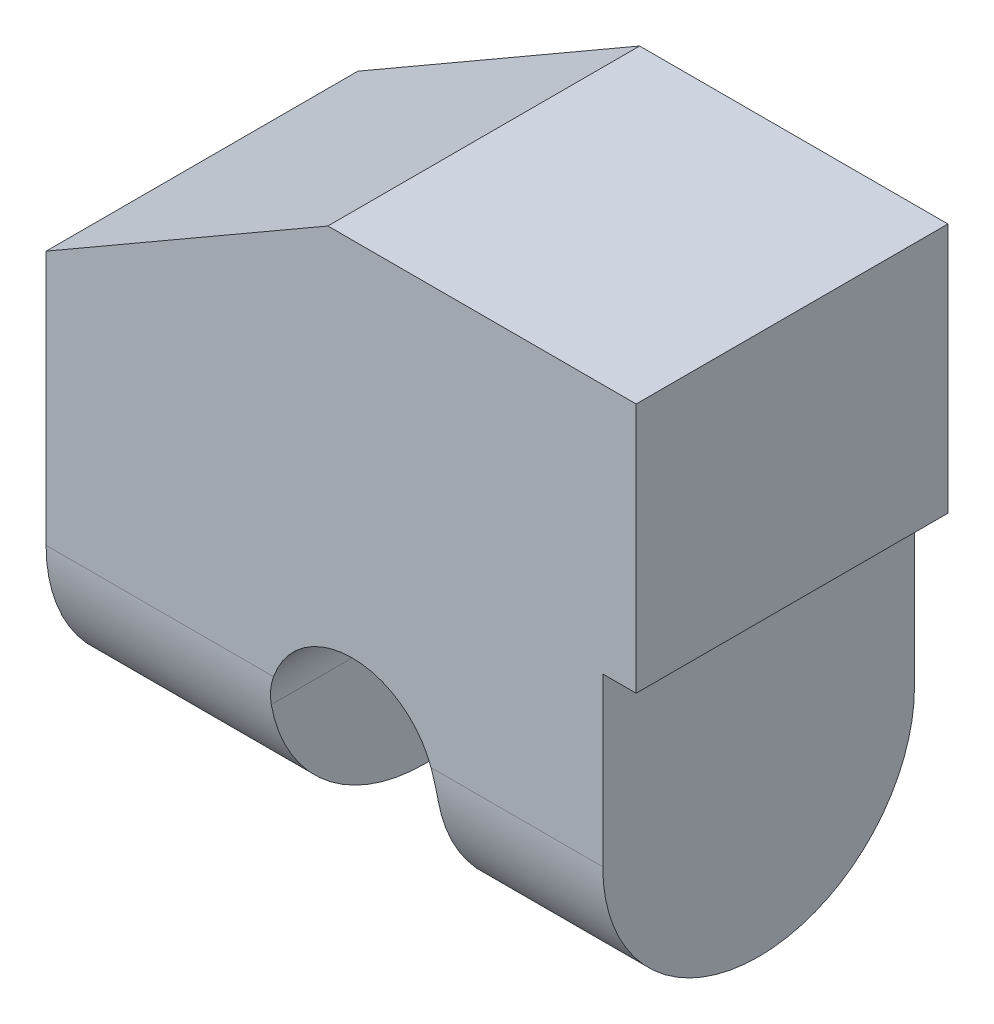
ISO-10303-21;
HEADER;
FILE_DESCRIPTION(('STEP AP214'),'2;1');
FILE_NAME('part.step','',(''),(''),'','','');
FILE_SCHEMA(('AUTOMOTIVE_DESIGN { 1 0 10303 214 1 1 1 1 }'));
ENDSEC;
DATA;
#1=APPLICATION_CONTEXT('core data for automotive mechanical design processes');
#2=APPLICATION_PROTOCOL_DEFINITION('international standard','automotive_design',2000,#1);
#3=PRODUCT_CONTEXT('',#1,'mechanical');
#4=PRODUCT('Part','Part','',(#3));
#5=PRODUCT_RELATED_PRODUCT_CATEGORY('part','',(#4));
#6=PRODUCT_DEFINITION_FORMATION('','',#4);
#7=PRODUCT_DEFINITION_CONTEXT('part definition',#1,'design');
#8=PRODUCT_DEFINITION('design','',#6,#7);
#9=PRODUCT_DEFINITION_SHAPE('','',#8);
#10=(LENGTH_UNIT() NAMED_UNIT(*) SI_UNIT(.MILLI.,.METRE.));
#11=(NAMED_UNIT(*) PLANE_ANGLE_UNIT() SI_UNIT($,.RADIAN.));
#12=(NAMED_UNIT(*) SI_UNIT($,.STERADIAN.) SOLID_ANGLE_UNIT());
#13=UNCERTAINTY_MEASURE_WITH_UNIT(LENGTH_MEASURE(1.E-05),#10,'distance_accuracy_value','');
#14=(GEOMETRIC_REPRESENTATION_CONTEXT(3) GLOBAL_UNCERTAINTY_ASSIGNED_CONTEXT((#13)) GLOBAL_UNIT_ASSIGNED_CONTEXT((#10,
#11,#12)) REPRESENTATION_CONTEXT('',''));
#15=CARTESIAN_POINT('',(0.,0.,0.));
#16=DIRECTION('',(0.,0.,1.));
#17=DIRECTION('',(1.,0.,0.));
#18=AXIS2_PLACEMENT_3D('',#15,#16,#17);
#19=CARTESIAN_POINT('',(-13.,37.5,-25.));
#20=DIRECTION('',(1.,0.,0.));
#21=DIRECTION('',(0.,0.,-1.));
#22=AXIS2_PLACEMENT_3D('',#19,#20,#21);
#23=PLANE('',#22);
#24=DIRECTION('',(0.,0.,1.));
#25=VECTOR('',#24,1.);
#26=CARTESIAN_POINT('',(-13.,42.5,-32.));
#27=LINE('',#26,#25);
#28=CARTESIAN_POINT('',(-13.,42.4999999999999,-21.2549954627912));
#29=VERTEX_POINT('',#28);
#30=CARTESIAN_POINT('',(-13.,42.5000000000008,-15.7450045372087));
#31=VERTEX_POINT('',#30);
#32=EDGE_CURVE('E186',#29,#31,#27,.T.);
#33=ORIENTED_EDGE('',*,*,#32,.T.);
#34=CARTESIAN_POINT('',(-13.,43.,-18.5));
#35=DIRECTION('',(1.,0.,0.));
#36=DIRECTION('',(0.,0.,-1.));
#37=AXIS2_PLACEMENT_3D('',#34,#35,#36);
#38=CIRCLE('',#37,2.8);
#39=EDGE_CURVE('E120',#29,#31,#38,.F.);
#40=ORIENTED_EDGE('',*,*,#39,.F.);
#41=EDGE_LOOP('',(#33,#40));
#42=FACE_BOUND('',#41,.T.);
#43=ADVANCED_FACE('F15',(#42),#23,.T.);
#44=CARTESIAN_POINT('',(-10.,37.5,-25.));
#45=DIRECTION('',(1.,0.,0.));
#46=DIRECTION('',(0.,0.,-1.));
#47=AXIS2_PLACEMENT_3D('',#44,#45,#46);
#48=PLANE('',#47);
#49=DIRECTION('',(0.,0.,1.));
#50=VECTOR('',#49,1.);
#51=CARTESIAN_POINT('',(-10.,42.5,-32.));
#52=LINE('',#51,#50);
#53=CARTESIAN_POINT('',(-10.,42.5000000000008,-15.7450045372087));
#54=VERTEX_POINT('',#53);
#55=CARTESIAN_POINT('',(-10.,42.4999999999999,-21.2549954627912));
#56=VERTEX_POINT('',#55);
#57=EDGE_CURVE('E123',#54,#56,#52,.F.);
#58=ORIENTED_EDGE('',*,*,#57,.T.);
#59=CARTESIAN_POINT('',(-10.,43.,-18.5));
#60=DIRECTION('',(1.,0.,0.));
#61=DIRECTION('',(0.,0.,-1.));
#62=AXIS2_PLACEMENT_3D('',#59,#60,#61);
#63=CIRCLE('',#62,2.8);
#64=EDGE_CURVE('E160',#54,#56,#63,.T.);
#65=ORIENTED_EDGE('',*,*,#64,.F.);
#66=EDGE_LOOP('',(#58,#65));
#67=FACE_BOUND('',#66,.T.);
#68=ADVANCED_FACE('F198',(#67),#48,.F.);
#69=CARTESIAN_POINT('',(-17.,46.,-21.3));
#70=DIRECTION('',(0.,1.,0.));
#71=DIRECTION('',(0.,0.,1.));
#72=AXIS2_PLACEMENT_3D('',#69,#70,#71);
#73=PLANE('',#72);
#74=DIRECTION('',(1.,0.,0.));
#75=VECTOR('',#74,1.);
#76=CARTESIAN_POINT('',(-17.,46.,-15.7));
#77=LINE('',#76,#75);
#78=CARTESIAN_POINT('',(-7.,46.,-15.7));
#79=VERTEX_POINT('',#78);
#80=CARTESIAN_POINT('',(-6.4,46.,-15.7));
#81=VERTEX_POINT('',#80);
#82=EDGE_CURVE('E133',#79,#81,#77,.T.);
#83=ORIENTED_EDGE('',*,*,#82,.F.);
#84=DIRECTION('',(0.,0.,-1.));
#85=VECTOR('',#84,1.);
#86=CARTESIAN_POINT('',(-7.,46.,-21.3));
#87=LINE('',#86,#85);
#88=CARTESIAN_POINT('',(-7.,46.,-21.3));
#89=VERTEX_POINT('',#88);
#90=EDGE_CURVE('E141',#89,#79,#87,.F.);
#91=ORIENTED_EDGE('',*,*,#90,.F.);
#92=DIRECTION('',(1.,0.,0.));
#93=VECTOR('',#92,1.);
#94=CARTESIAN_POINT('',(-17.,46.,-21.3));
#95=LINE('',#94,#93);
#96=CARTESIAN_POINT('',(-6.4,46.,-21.3));
#97=VERTEX_POINT('',#96);
#98=EDGE_CURVE('E116',#89,#97,#95,.T.);
#99=ORIENTED_EDGE('',*,*,#98,.T.);
#100=DIRECTION('',(0.,0.,-1.));
#101=VECTOR('',#100,1.);
#102=CARTESIAN_POINT('',(-6.4,46.,-21.3));
#103=LINE('',#102,#101);
#104=EDGE_CURVE('E138',#81,#97,#103,.T.);
#105=ORIENTED_EDGE('',*,*,#104,.F.);
#106=EDGE_LOOP('',(#83,#91,#99,#105));
#107=FACE_BOUND('',#106,.T.);
#108=ADVANCED_FACE('F195',(#107),#73,.F.);
#109=CARTESIAN_POINT('',(-17.,43.,-18.5));
#110=DIRECTION('',(1.,0.,0.));
#111=DIRECTION('',(0.,0.,-1.));
#112=AXIS2_PLACEMENT_3D('',#109,#110,#111);
#113=CYLINDRICAL_SURFACE('',#112,2.8);
#114=CARTESIAN_POINT('',(-12.9142135623728,43.000000000001,-21.3));
#115=CARTESIAN_POINT('',(-12.9285217575544,42.9595589740687,-21.3000092637477));
#116=CARTESIAN_POINT('',(-12.9410779090966,42.9184956837706,-21.2991238254477));
#117=CARTESIAN_POINT('',(-12.9625201524421,42.8359037997053,-21.2954879363588));
#118=CARTESIAN_POINT('',(-12.9714386859107,42.7943828702396,-21.2927545763688));
#119=CARTESIAN_POINT('',(-12.9857029875508,42.7109023196058,-21.2853505908554));
#120=CARTESIAN_POINT('',(-12.9910487540143,42.6689426982282,-21.2806799644057));
#121=CARTESIAN_POINT('',(-12.9982185473388,42.5845948398803,-21.2693465406203));
#122=CARTESIAN_POINT('',(-13.000009693241,42.5422062138142,-21.2626657956333));
#123=CARTESIAN_POINT('',(-13.,42.4999999999998,-21.2549954627911));
#124=B_SPLINE_CURVE_WITH_KNOTS('',3,(#114,#115,#116,#117,#118,#119,#120,#121,#122,#123),
.UNSPECIFIED.,.F.,.F.,(4,2,2,2,4),(0.,0.128647149682814,0.25612047390736,0.383593859073167,
0.512241002542359),.UNSPECIFIED.);
#125=CARTESIAN_POINT('',(-12.9142135623729,43.0000000000005,-21.3));
#126=VERTEX_POINT('',#125);
#127=EDGE_CURVE('E187',#126,#29,#124,.T.);
#128=ORIENTED_EDGE('',*,*,#127,.T.);
#129=ORIENTED_EDGE('',*,*,#39,.T.);
#130=CARTESIAN_POINT('',(-13.,42.5000000000016,-15.7450045372085));
#131=CARTESIAN_POINT('',(-13.0000096932409,42.5422062138158,-15.7373342043665));
#132=CARTESIAN_POINT('',(-12.9982185473388,42.5845948398817,-15.7306534593795));
#133=CARTESIAN_POINT('',(-12.9910487540142,42.6689426982294,-15.7193200355942));
#134=CARTESIAN_POINT('',(-12.9857029875507,42.7109023196069,-15.7146494091445));
#135=CARTESIAN_POINT('',(-12.9714386859106,42.7943828702403,-15.7072454236311));
#136=CARTESIAN_POINT('',(-12.962520152442,42.8359037997059,-15.7045120636412));
#137=CARTESIAN_POINT('',(-12.9410779090965,42.9184956837709,-15.7008761745523));
#138=CARTESIAN_POINT('',(-12.9285217575543,42.9595589740689,-15.6999907362523));
#139=CARTESIAN_POINT('',(-12.9142135623728,43.000000000001,-15.7));
#140=B_SPLINE_CURVE_WITH_KNOTS('',3,(#130,#131,#132,#133,#134,#135,#136,#137,#138,#139),
.UNSPECIFIED.,.F.,.F.,(4,2,2,2,4),(0.,0.128647143468736,0.256120528634098,0.383593852858199,
0.512241002540562),.UNSPECIFIED.);
#141=CARTESIAN_POINT('',(-12.9142135623729,43.0000000000005,-15.7));
#142=VERTEX_POINT('',#141);
#143=EDGE_CURVE('E181',#31,#142,#140,.T.);
#144=ORIENTED_EDGE('',*,*,#143,.T.);
#145=DIRECTION('',(1.,0.,0.));
#146=VECTOR('',#145,1.);
#147=CARTESIAN_POINT('',(-17.,43.,-15.7));
#148=LINE('',#147,#146);
#149=CARTESIAN_POINT('',(-17.,43.,-15.7));
#150=VERTEX_POINT('',#149);
#151=EDGE_CURVE('E114',#150,#142,#148,.T.);
#152=ORIENTED_EDGE('',*,*,#151,.F.);
#153=CARTESIAN_POINT('',(-17.,43.,-18.5));
#154=DIRECTION('',(1.,0.,0.));
#155=DIRECTION('',(0.,0.,-1.));
#156=AXIS2_PLACEMENT_3D('',#153,#154,#155);
#157=CIRCLE('',#156,2.8);
#158=CARTESIAN_POINT('',(-17.,43.,-21.3));
#159=VERTEX_POINT('',#158);
#160=EDGE_CURVE('E18',#150,#159,#157,.T.);
#161=ORIENTED_EDGE('',*,*,#160,.T.);
#162=DIRECTION('',(1.,0.,0.));
#163=VECTOR('',#162,1.);
#164=CARTESIAN_POINT('',(-17.,43.,-21.3));
#165=LINE('',#164,#163);
#166=EDGE_CURVE('E111',#159,#126,#165,.T.);
#167=ORIENTED_EDGE('',*,*,#166,.T.);
#168=EDGE_LOOP('',(#128,#129,#144,#152,#161,#167));
#169=FACE_BOUND('',#168,.T.);
#170=ADVANCED_FACE('F110',(#169),#113,.T.);
#171=CARTESIAN_POINT('',(-11.5,42.5,-32.));
#172=DIRECTION('',(0.,0.,1.));
#173=DIRECTION('',(1.,0.,0.));
#174=AXIS2_PLACEMENT_3D('',#171,#172,#173);
#175=CYLINDRICAL_SURFACE('',#174,1.5);
#176=ORIENTED_EDGE('',*,*,#143,.F.);
#177=ORIENTED_EDGE('',*,*,#32,.F.);
#178=ORIENTED_EDGE('',*,*,#127,.F.);
#179=CARTESIAN_POINT('',(-11.5,42.5,-21.3));
#180=DIRECTION('',(0.,0.,1.));
#181=DIRECTION('',(1.,0.,0.));
#182=AXIS2_PLACEMENT_3D('',#179,#180,#181);
#183=CIRCLE('',#182,1.5);
#184=CARTESIAN_POINT('',(-10.0857864376265,42.9999999999989,-21.3));
#185=VERTEX_POINT('',#184);
#186=EDGE_CURVE('E119',#185,#126,#183,.T.);
#187=ORIENTED_EDGE('',*,*,#186,.F.);
#188=CARTESIAN_POINT('',(-10.,42.4999999999998,-21.2549954627911));
#189=CARTESIAN_POINT('',(-9.99999030675902,42.5422062138139,-21.2626657956332));
#190=CARTESIAN_POINT('',(-10.0017814526611,42.5845948398797,-21.2693465406202));
#191=CARTESIAN_POINT('',(-10.0089512459856,42.6689426982271,-21.2806799644056));
#192=CARTESIAN_POINT('',(-10.014297012449,42.7109023196045,-21.2853505908552));
#193=CARTESIAN_POINT('',(-10.0285613140889,42.7943828702377,-21.2927545763687));
#194=CARTESIAN_POINT('',(-10.0374798475574,42.8359037997032,-21.2954879363587));
#195=CARTESIAN_POINT('',(-10.0589220909026,42.9184956837679,-21.2991238254476));
#196=CARTESIAN_POINT('',(-10.0714782424447,42.9595589740658,-21.3000092637477));
#197=CARTESIAN_POINT('',(-10.0857864376261,42.9999999999978,-21.3));
#198=B_SPLINE_CURVE_WITH_KNOTS('',3,(#188,#189,#190,#191,#192,#193,#194,#195,#196,#197),
.UNSPECIFIED.,.F.,.F.,(4,2,2,2,4),(0.,0.128647143468349,0.256120528633332,0.383593852857057,
0.512241002539021),.UNSPECIFIED.);
#199=EDGE_CURVE('E151',#56,#185,#198,.T.);
#200=ORIENTED_EDGE('',*,*,#199,.F.);
#201=ORIENTED_EDGE('',*,*,#57,.F.);
#202=CARTESIAN_POINT('',(-10.0857864376261,42.9999999999978,-15.7));
#203=CARTESIAN_POINT('',(-10.0714782424447,42.959558974066,-15.6999907362523));
#204=CARTESIAN_POINT('',(-10.0589220909027,42.9184956837682,-15.7008761745524));
#205=CARTESIAN_POINT('',(-10.0374798475575,42.8359037997038,-15.7045120636413));
#206=CARTESIAN_POINT('',(-10.028561314089,42.7943828702384,-15.7072454236313));
#207=CARTESIAN_POINT('',(-10.0142970124491,42.7109023196055,-15.7146494091447));
#208=CARTESIAN_POINT('',(-10.0089512459857,42.6689426982283,-15.7193200355943));
#209=CARTESIAN_POINT('',(-10.0017814526612,42.5845948398812,-15.7306534593796));
#210=CARTESIAN_POINT('',(-9.99999030675907,42.5422062138156,-15.7373342043665));
#211=CARTESIAN_POINT('',(-10.,42.5000000000016,-15.7450045372085));
#212=B_SPLINE_CURVE_WITH_KNOTS('',3,(#202,#203,#204,#205,#206,#207,#208,#209,#210,#211),
.UNSPECIFIED.,.F.,.F.,(4,2,2,2,4),(0.,0.128647149681513,0.256120473904793,0.383593859069339,
0.512241002537233),.UNSPECIFIED.);
#213=CARTESIAN_POINT('',(-10.0857864376265,42.9999999999989,-15.7));
#214=VERTEX_POINT('',#213);
#215=EDGE_CURVE('E173',#214,#54,#212,.T.);
#216=ORIENTED_EDGE('',*,*,#215,.F.);
#217=CARTESIAN_POINT('',(-11.5,42.5,-15.7));
#218=DIRECTION('',(0.,0.,1.));
#219=DIRECTION('',(1.,0.,0.));
#220=AXIS2_PLACEMENT_3D('',#217,#218,#219);
#221=CIRCLE('',#220,1.5);
#222=EDGE_CURVE('E147',#142,#214,#221,.F.);
#223=ORIENTED_EDGE('',*,*,#222,.F.);
#224=EDGE_LOOP('',(#176,#177,#178,#187,#200,#201,#216,#223));
#225=FACE_BOUND('',#224,.T.);
#226=ADVANCED_FACE('F162',(#225),#175,.F.);
#227=CARTESIAN_POINT('',(-17.,43.,-18.5));
#228=DIRECTION('',(1.,0.,0.));
#229=DIRECTION('',(0.,0.,-1.));
#230=AXIS2_PLACEMENT_3D('',#227,#228,#229);
#231=CYLINDRICAL_SURFACE('',#230,2.8);
#232=ORIENTED_EDGE('',*,*,#199,.T.);
#233=DIRECTION('',(1.,0.,0.));
#234=VECTOR('',#233,1.);
#235=CARTESIAN_POINT('',(-17.,43.,-21.3));
#236=LINE('',#235,#234);
#237=CARTESIAN_POINT('',(-7.,43.,-21.3));
#238=VERTEX_POINT('',#237);
#239=EDGE_CURVE('E159',#185,#238,#236,.T.);
#240=ORIENTED_EDGE('',*,*,#239,.T.);
#241=CARTESIAN_POINT('',(-7.,43.,-18.5));
#242=DIRECTION('',(1.,0.,0.));
#243=DIRECTION('',(0.,0.,-1.));
#244=AXIS2_PLACEMENT_3D('',#241,#242,#243);
#245=CIRCLE('',#244,2.8);
#246=CARTESIAN_POINT('',(-7.,43.,-15.7));
#247=VERTEX_POINT('',#246);
#248=EDGE_CURVE('E179',#238,#247,#245,.F.);
#249=ORIENTED_EDGE('',*,*,#248,.T.);
#250=DIRECTION('',(1.,0.,0.));
#251=VECTOR('',#250,1.);
#252=CARTESIAN_POINT('',(-17.,43.,-15.7));
#253=LINE('',#252,#251);
#254=EDGE_CURVE('E150',#214,#247,#253,.T.);
#255=ORIENTED_EDGE('',*,*,#254,.F.);
#256=ORIENTED_EDGE('',*,*,#215,.T.);
#257=ORIENTED_EDGE('',*,*,#64,.T.);
#258=EDGE_LOOP('',(#232,#240,#249,#255,#256,#257));
#259=FACE_BOUND('',#258,.T.);
#260=ADVANCED_FACE('F165',(#259),#231,.T.);
#261=CARTESIAN_POINT('',(-7.,43.,-21.3));
#262=DIRECTION('',(1.,0.,0.));
#263=DIRECTION('',(0.,0.,-1.));
#264=AXIS2_PLACEMENT_3D('',#261,#262,#263);
#265=PLANE('',#264);
#266=DIRECTION('',(0.,1.,0.));
#267=VECTOR('',#266,1.);
#268=CARTESIAN_POINT('',(-7.,43.,-21.3));
#269=LINE('',#268,#267);
#270=EDGE_CURVE('E251',#238,#89,#269,.T.);
#271=ORIENTED_EDGE('',*,*,#270,.T.);
#272=ORIENTED_EDGE('',*,*,#90,.T.);
#273=DIRECTION('',(0.,1.,0.));
#274=VECTOR('',#273,1.);
#275=CARTESIAN_POINT('',(-7.,43.,-15.7));
#276=LINE('',#275,#274);
#277=EDGE_CURVE('E146',#247,#79,#276,.T.);
#278=ORIENTED_EDGE('',*,*,#277,.F.);
#279=ORIENTED_EDGE('',*,*,#248,.F.);
#280=EDGE_LOOP('',(#271,#272,#278,#279));
#281=FACE_BOUND('',#280,.T.);
#282=ADVANCED_FACE('F169',(#281),#265,.T.);
#283=CARTESIAN_POINT('',(-6.4,46.,-21.3));
#284=DIRECTION('',(1.,0.,0.));
#285=DIRECTION('',(0.,0.,-1.));
#286=AXIS2_PLACEMENT_3D('',#283,#284,#285);
#287=PLANE('',#286);
#288=DIRECTION('',(0.,0.,1.));
#289=VECTOR('',#288,1.);
#290=CARTESIAN_POINT('',(-6.4,50.5,-21.3));
#291=LINE('',#290,#289);
#292=CARTESIAN_POINT('',(-6.4,50.5,-15.7));
#293=VERTEX_POINT('',#292);
#294=CARTESIAN_POINT('',(-6.4,50.5,-21.3));
#295=VERTEX_POINT('',#294);
#296=EDGE_CURVE('E105',#293,#295,#291,.F.);
#297=ORIENTED_EDGE('',*,*,#296,.F.);
#298=DIRECTION('',(0.,1.,0.));
#299=VECTOR('',#298,1.);
#300=CARTESIAN_POINT('',(-6.4,46.,-15.7));
#301=LINE('',#300,#299);
#302=EDGE_CURVE('E142',#81,#293,#301,.T.);
#303=ORIENTED_EDGE('',*,*,#302,.F.);
#304=ORIENTED_EDGE('',*,*,#104,.T.);
#305=DIRECTION('',(0.,1.,0.));
#306=VECTOR('',#305,1.);
#307=CARTESIAN_POINT('',(-6.4,46.,-21.3));
#308=LINE('',#307,#306);
#309=EDGE_CURVE('E135',#97,#295,#308,.T.);
#310=ORIENTED_EDGE('',*,*,#309,.T.);
#311=EDGE_LOOP('',(#297,#303,#304,#310));
#312=FACE_BOUND('',#311,.T.);
#313=ADVANCED_FACE('F225',(#312),#287,.T.);
#314=CARTESIAN_POINT('',(-17.,43.,-21.3));
#315=DIRECTION('',(0.,0.,1.));
#316=DIRECTION('',(1.,0.,0.));
#317=AXIS2_PLACEMENT_3D('',#314,#315,#316);
#318=PLANE('',#317);
#319=DIRECTION('',(1.,0.,0.));
#320=VECTOR('',#319,1.);
#321=CARTESIAN_POINT('',(-17.,50.5,-21.3));
#322=LINE('',#321,#320);
#323=CARTESIAN_POINT('',(-11.9378221735007,50.5000000000013,-21.3));
#324=VERTEX_POINT('',#323);
#325=EDGE_CURVE('E145',#295,#324,#322,.F.);
#326=ORIENTED_EDGE('',*,*,#325,.F.);
#327=ORIENTED_EDGE('',*,*,#309,.F.);
#328=ORIENTED_EDGE('',*,*,#98,.F.);
#329=ORIENTED_EDGE('',*,*,#270,.F.);
#330=ORIENTED_EDGE('',*,*,#239,.F.);
#331=ORIENTED_EDGE('',*,*,#186,.T.);
#332=ORIENTED_EDGE('',*,*,#166,.F.);
#333=DIRECTION('',(0.,1.,0.));
#334=VECTOR('',#333,1.);
#335=CARTESIAN_POINT('',(-17.,43.,-21.3));
#336=LINE('',#335,#334);
#337=CARTESIAN_POINT('',(-17.,47.57735026919,-21.3));
#338=VERTEX_POINT('',#337);
#339=EDGE_CURVE('E94',#159,#338,#336,.T.);
#340=ORIENTED_EDGE('',*,*,#339,.T.);
#341=DIRECTION('',(-0.866025403784329,-0.50000000000019,0.));
#342=VECTOR('',#341,1.);
#343=CARTESIAN_POINT('',(-18.,47.,-21.3));
#344=LINE('',#343,#342);
#345=EDGE_CURVE('E130',#324,#338,#344,.T.);
#346=ORIENTED_EDGE('',*,*,#345,.F.);
#347=EDGE_LOOP('',(#326,#327,#328,#329,#330,#331,#332,#340,#346));
#348=FACE_BOUND('',#347,.T.);
#349=ADVANCED_FACE('F117',(#348),#318,.F.);
#350=CARTESIAN_POINT('',(-17.,43.,-21.3));
#351=DIRECTION('',(1.,0.,0.));
#352=DIRECTION('',(0.,0.,-1.));
#353=AXIS2_PLACEMENT_3D('',#350,#351,#352);
#354=PLANE('',#353);
#355=ORIENTED_EDGE('',*,*,#339,.F.);
#356=ORIENTED_EDGE('',*,*,#160,.F.);
#357=DIRECTION('',(0.,1.,0.));
#358=VECTOR('',#357,1.);
#359=CARTESIAN_POINT('',(-17.,43.,-15.7));
#360=LINE('',#359,#358);
#361=CARTESIAN_POINT('',(-17.,47.57735026919,-15.7));
#362=VERTEX_POINT('',#361);
#363=EDGE_CURVE('E104',#362,#150,#360,.F.);
#364=ORIENTED_EDGE('',*,*,#363,.F.);
#365=DIRECTION('',(0.,0.,1.));
#366=VECTOR('',#365,1.);
#367=CARTESIAN_POINT('',(-17.,47.5773502691899,-32.));
#368=LINE('',#367,#366);
#369=EDGE_CURVE('E99',#338,#362,#368,.T.);
#370=ORIENTED_EDGE('',*,*,#369,.F.);
#371=EDGE_LOOP('',(#355,#356,#364,#370));
#372=FACE_BOUND('',#371,.T.);
#373=ADVANCED_FACE('F96',(#372),#354,.F.);
#374=CARTESIAN_POINT('',(-17.,50.5,-21.3));
#375=DIRECTION('',(0.,1.,0.));
#376=DIRECTION('',(0.,0.,1.));
#377=AXIS2_PLACEMENT_3D('',#374,#375,#376);
#378=PLANE('',#377);
#379=DIRECTION('',(1.,0.,0.));
#380=VECTOR('',#379,1.);
#381=CARTESIAN_POINT('',(-17.,50.5,-15.7));
#382=LINE('',#381,#380);
#383=CARTESIAN_POINT('',(-11.9378221735007,50.5000000000013,-15.7));
#384=VERTEX_POINT('',#383);
#385=EDGE_CURVE('E24',#293,#384,#382,.F.);
#386=ORIENTED_EDGE('',*,*,#385,.F.);
#387=ORIENTED_EDGE('',*,*,#296,.T.);
#388=ORIENTED_EDGE('',*,*,#325,.T.);
#389=DIRECTION('',(0.,0.,1.));
#390=VECTOR('',#389,1.);
#391=CARTESIAN_POINT('',(-11.937822173503,50.5000000000052,-32.));
#392=LINE('',#391,#390);
#393=EDGE_CURVE('E33',#384,#324,#392,.F.);
#394=ORIENTED_EDGE('',*,*,#393,.F.);
#395=EDGE_LOOP('',(#386,#387,#388,#394));
#396=FACE_BOUND('',#395,.T.);
#397=ADVANCED_FACE('F215',(#396),#378,.T.);
#398=CARTESIAN_POINT('',(-18.,47.,-32.));
#399=DIRECTION('',(-0.50000000000019,0.866025403784329,0.));
#400=DIRECTION('',(-0.866025403784329,-0.50000000000019,0.));
#401=AXIS2_PLACEMENT_3D('',#398,#399,#400);
#402=PLANE('',#401);
#403=ORIENTED_EDGE('',*,*,#345,.T.);
#404=ORIENTED_EDGE('',*,*,#369,.T.);
#405=DIRECTION('',(-0.866025403784848,-0.499999999999291,0.));
#406=VECTOR('',#405,1.);
#407=CARTESIAN_POINT('',(-11.9378221735,50.5,-15.7));
#408=LINE('',#407,#406);
#409=EDGE_CURVE('E10',#384,#362,#408,.T.);
#410=ORIENTED_EDGE('',*,*,#409,.F.);
#411=ORIENTED_EDGE('',*,*,#393,.T.);
#412=EDGE_LOOP('',(#403,#404,#410,#411));
#413=FACE_BOUND('',#412,.T.);
#414=ADVANCED_FACE('F209',(#413),#402,.T.);
#415=CARTESIAN_POINT('',(-17.,43.,-15.7));
#416=DIRECTION('',(0.,0.,1.));
#417=DIRECTION('',(1.,0.,0.));
#418=AXIS2_PLACEMENT_3D('',#415,#416,#417);
#419=PLANE('',#418);
#420=ORIENTED_EDGE('',*,*,#385,.T.);
#421=ORIENTED_EDGE('',*,*,#409,.T.);
#422=ORIENTED_EDGE('',*,*,#363,.T.);
#423=ORIENTED_EDGE('',*,*,#151,.T.);
#424=ORIENTED_EDGE('',*,*,#222,.T.);
#425=ORIENTED_EDGE('',*,*,#254,.T.);
#426=ORIENTED_EDGE('',*,*,#277,.T.);
#427=ORIENTED_EDGE('',*,*,#82,.T.);
#428=ORIENTED_EDGE('',*,*,#302,.T.);
#429=EDGE_LOOP('',(#420,#421,#422,#423,#424,#425,#426,#427,#428));
#430=FACE_BOUND('',#429,.T.);
#431=ADVANCED_FACE('F207',(#430),#419,.T.);
#432=CLOSED_SHELL('',(#43,#68,#108,#170,#226,#260,#282,#313,#349,#373,#397,#414,#431));
#433=MANIFOLD_SOLID_BREP('B1',#432);
#434=ADVANCED_BREP_SHAPE_REPRESENTATION('',(#18,#433),#14);
#435=SHAPE_DEFINITION_REPRESENTATION(#9,#434);
ENDSEC;
END-ISO-10303-21;
